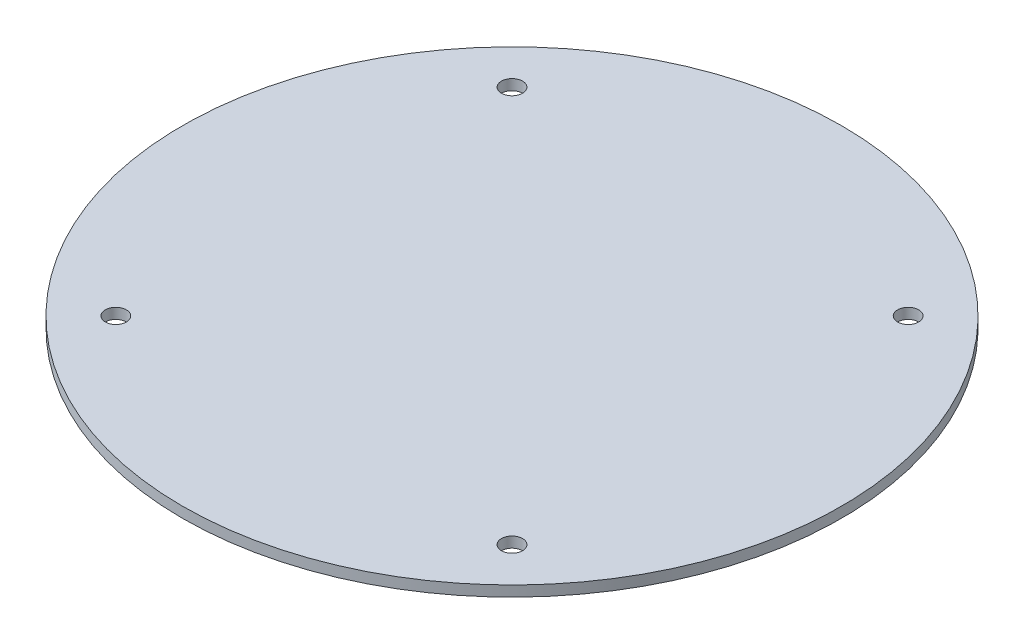
ISO-10303-21;
HEADER;
FILE_DESCRIPTION(('STEP AP214'),'2;1');
FILE_NAME('part.step','',(''),(''),'','','');
FILE_SCHEMA(('AUTOMOTIVE_DESIGN { 1 0 10303 214 1 1 1 1 }'));
ENDSEC;
DATA;
#1=APPLICATION_CONTEXT('core data for automotive mechanical design processes');
#2=APPLICATION_PROTOCOL_DEFINITION('international standard','automotive_design',2000,#1);
#3=PRODUCT_CONTEXT('',#1,'mechanical');
#4=PRODUCT('Part','Part','',(#3));
#5=PRODUCT_RELATED_PRODUCT_CATEGORY('part','',(#4));
#6=PRODUCT_DEFINITION_FORMATION('','',#4);
#7=PRODUCT_DEFINITION_CONTEXT('part definition',#1,'design');
#8=PRODUCT_DEFINITION('design','',#6,#7);
#9=PRODUCT_DEFINITION_SHAPE('','',#8);
#10=(LENGTH_UNIT() NAMED_UNIT(*) SI_UNIT(.MILLI.,.METRE.));
#11=(NAMED_UNIT(*) PLANE_ANGLE_UNIT() SI_UNIT($,.RADIAN.));
#12=(NAMED_UNIT(*) SI_UNIT($,.STERADIAN.) SOLID_ANGLE_UNIT());
#13=UNCERTAINTY_MEASURE_WITH_UNIT(LENGTH_MEASURE(1.E-05),#10,'distance_accuracy_value','');
#14=(GEOMETRIC_REPRESENTATION_CONTEXT(3) GLOBAL_UNCERTAINTY_ASSIGNED_CONTEXT((#13)) GLOBAL_UNIT_ASSIGNED_CONTEXT((#10,
#11,#12)) REPRESENTATION_CONTEXT('',''));
#15=CARTESIAN_POINT('',(0.,0.,0.));
#16=DIRECTION('',(0.,0.,1.));
#17=DIRECTION('',(1.,0.,0.));
#18=AXIS2_PLACEMENT_3D('',#15,#16,#17);
#19=CARTESIAN_POINT('',(0.,1.6,0.));
#20=DIRECTION('',(0.,-1.,0.));
#21=DIRECTION('',(0.,0.,-1.));
#22=AXIS2_PLACEMENT_3D('',#19,#20,#21);
#23=CYLINDRICAL_SURFACE('',#22,50.);
#24=CARTESIAN_POINT('',(0.,1.6,0.));
#25=DIRECTION('',(0.,1.,0.));
#26=DIRECTION('',(0.,0.,1.));
#27=AXIS2_PLACEMENT_3D('',#24,#25,#26);
#28=CIRCLE('',#27,50.);
#29=CARTESIAN_POINT('',(0.,1.6,50.));
#30=VERTEX_POINT('',#29);
#31=EDGE_CURVE('E11',#30,#30,#28,.T.);
#32=ORIENTED_EDGE('',*,*,#31,.F.);
#33=EDGE_LOOP('',(#32));
#34=FACE_BOUND('',#33,.T.);
#35=CARTESIAN_POINT('',(0.,0.,0.));
#36=DIRECTION('',(0.,1.,0.));
#37=DIRECTION('',(0.,0.,1.));
#38=AXIS2_PLACEMENT_3D('',#35,#36,#37);
#39=CIRCLE('',#38,50.);
#40=CARTESIAN_POINT('',(0.,0.,50.));
#41=VERTEX_POINT('',#40);
#42=EDGE_CURVE('E42',#41,#41,#39,.T.);
#43=ORIENTED_EDGE('',*,*,#42,.T.);
#44=EDGE_LOOP('',(#43));
#45=FACE_BOUND('',#44,.T.);
#46=ADVANCED_FACE('F41',(#34,#45),#23,.T.);
#47=CARTESIAN_POINT('',(0.,1.6,0.));
#48=DIRECTION('',(0.,1.,0.));
#49=DIRECTION('',(0.,0.,1.));
#50=AXIS2_PLACEMENT_3D('',#47,#48,#49);
#51=PLANE('',#50);
#52=CARTESIAN_POINT('',(30.0520382004278,1.6,-30.0520382004288));
#53=DIRECTION('',(0.,-1.,0.));
#54=DIRECTION('',(0.,0.,-1.));
#55=AXIS2_PLACEMENT_3D('',#52,#53,#54);
#56=CIRCLE('',#55,1.60000000000001);
#57=CARTESIAN_POINT('',(30.0520382004278,1.6,-31.6520382004288));
#58=VERTEX_POINT('',#57);
#59=EDGE_CURVE('E65',#58,#58,#56,.T.);
#60=ORIENTED_EDGE('',*,*,#59,.T.);
#61=EDGE_LOOP('',(#60));
#62=FACE_BOUND('',#61,.T.);
#63=CARTESIAN_POINT('',(30.0520382004286,1.6,30.0520382004279));
#64=DIRECTION('',(0.,-1.,0.));
#65=DIRECTION('',(0.,0.,-1.));
#66=AXIS2_PLACEMENT_3D('',#63,#64,#65);
#67=CIRCLE('',#66,1.60000000000001);
#68=CARTESIAN_POINT('',(30.0520382004286,1.6,28.4520382004279));
#69=VERTEX_POINT('',#68);
#70=EDGE_CURVE('E76',#69,#69,#67,.T.);
#71=ORIENTED_EDGE('',*,*,#70,.T.);
#72=EDGE_LOOP('',(#71));
#73=FACE_BOUND('',#72,.T.);
#74=CARTESIAN_POINT('',(-30.0520382004284,1.6,30.0520382004284));
#75=DIRECTION('',(0.,-1.,0.));
#76=DIRECTION('',(0.,0.,-1.));
#77=AXIS2_PLACEMENT_3D('',#74,#75,#76);
#78=CIRCLE('',#77,1.60000000000002);
#79=CARTESIAN_POINT('',(-30.0520382004284,1.6,28.4520382004284));
#80=VERTEX_POINT('',#79);
#81=EDGE_CURVE('E68',#80,#80,#78,.T.);
#82=ORIENTED_EDGE('',*,*,#81,.T.);
#83=EDGE_LOOP('',(#82));
#84=FACE_BOUND('',#83,.T.);
#85=CARTESIAN_POINT('',(-30.0520382004284,1.6,-30.0520382004281));
#86=DIRECTION('',(0.,-1.,0.));
#87=DIRECTION('',(0.,0.,-1.));
#88=AXIS2_PLACEMENT_3D('',#85,#86,#87);
#89=CIRCLE('',#88,1.60000000000001);
#90=CARTESIAN_POINT('',(-30.0520382004284,1.6,-31.6520382004281));
#91=VERTEX_POINT('',#90);
#92=EDGE_CURVE('E55',#91,#91,#89,.T.);
#93=ORIENTED_EDGE('',*,*,#92,.T.);
#94=EDGE_LOOP('',(#93));
#95=FACE_BOUND('',#94,.T.);
#96=ORIENTED_EDGE('',*,*,#31,.T.);
#97=EDGE_LOOP('',(#96));
#98=FACE_BOUND('',#97,.T.);
#99=ADVANCED_FACE('F89',(#62,#73,#84,#95,#98),#51,.T.);
#100=CARTESIAN_POINT('',(0.,0.,0.));
#101=DIRECTION('',(0.,1.,0.));
#102=DIRECTION('',(0.,0.,1.));
#103=AXIS2_PLACEMENT_3D('',#100,#101,#102);
#104=PLANE('',#103);
#105=CARTESIAN_POINT('',(30.0520382004278,0.,-30.0520382004288));
#106=DIRECTION('',(0.,-1.,0.));
#107=DIRECTION('',(0.,0.,-1.));
#108=AXIS2_PLACEMENT_3D('',#105,#106,#107);
#109=CIRCLE('',#108,1.60000000000001);
#110=CARTESIAN_POINT('',(30.0520382004278,0.,-31.6520382004288));
#111=VERTEX_POINT('',#110);
#112=EDGE_CURVE('E85',#111,#111,#109,.T.);
#113=ORIENTED_EDGE('',*,*,#112,.F.);
#114=EDGE_LOOP('',(#113));
#115=FACE_BOUND('',#114,.T.);
#116=CARTESIAN_POINT('',(30.0520382004286,0.,30.0520382004279));
#117=DIRECTION('',(0.,-1.,0.));
#118=DIRECTION('',(0.,0.,-1.));
#119=AXIS2_PLACEMENT_3D('',#116,#117,#118);
#120=CIRCLE('',#119,1.60000000000001);
#121=CARTESIAN_POINT('',(30.0520382004286,0.,28.4520382004279));
#122=VERTEX_POINT('',#121);
#123=EDGE_CURVE('E78',#122,#122,#120,.T.);
#124=ORIENTED_EDGE('',*,*,#123,.F.);
#125=EDGE_LOOP('',(#124));
#126=FACE_BOUND('',#125,.T.);
#127=CARTESIAN_POINT('',(-30.0520382004284,0.,30.0520382004284));
#128=DIRECTION('',(0.,-1.,0.));
#129=DIRECTION('',(0.,0.,-1.));
#130=AXIS2_PLACEMENT_3D('',#127,#128,#129);
#131=CIRCLE('',#130,1.60000000000002);
#132=CARTESIAN_POINT('',(-30.0520382004284,0.,28.4520382004284));
#133=VERTEX_POINT('',#132);
#134=EDGE_CURVE('E59',#133,#133,#131,.T.);
#135=ORIENTED_EDGE('',*,*,#134,.F.);
#136=EDGE_LOOP('',(#135));
#137=FACE_BOUND('',#136,.T.);
#138=CARTESIAN_POINT('',(-30.0520382004284,0.,-30.0520382004281));
#139=DIRECTION('',(0.,-1.,0.));
#140=DIRECTION('',(0.,0.,-1.));
#141=AXIS2_PLACEMENT_3D('',#138,#139,#140);
#142=CIRCLE('',#141,1.60000000000001);
#143=CARTESIAN_POINT('',(-30.0520382004284,0.,-31.6520382004281));
#144=VERTEX_POINT('',#143);
#145=EDGE_CURVE('E54',#144,#144,#142,.T.);
#146=ORIENTED_EDGE('',*,*,#145,.F.);
#147=EDGE_LOOP('',(#146));
#148=FACE_BOUND('',#147,.T.);
#149=ORIENTED_EDGE('',*,*,#42,.F.);
#150=EDGE_LOOP('',(#149));
#151=FACE_BOUND('',#150,.T.);
#152=ADVANCED_FACE('F109',(#115,#126,#137,#148,#151),#104,.F.);
#153=CARTESIAN_POINT('',(-30.0520382004284,1.6,-30.0520382004281));
#154=DIRECTION('',(0.,-1.,0.));
#155=DIRECTION('',(0.,0.,-1.));
#156=AXIS2_PLACEMENT_3D('',#153,#154,#155);
#157=CYLINDRICAL_SURFACE('',#156,1.60000000000001);
#158=ORIENTED_EDGE('',*,*,#92,.F.);
#159=EDGE_LOOP('',(#158));
#160=FACE_BOUND('',#159,.T.);
#161=ORIENTED_EDGE('',*,*,#145,.T.);
#162=EDGE_LOOP('',(#161));
#163=FACE_BOUND('',#162,.T.);
#164=ADVANCED_FACE('F113',(#160,#163),#157,.F.);
#165=CARTESIAN_POINT('',(-30.0520382004284,1.6,30.0520382004284));
#166=DIRECTION('',(0.,-1.,0.));
#167=DIRECTION('',(0.,0.,-1.));
#168=AXIS2_PLACEMENT_3D('',#165,#166,#167);
#169=CYLINDRICAL_SURFACE('',#168,1.60000000000002);
#170=ORIENTED_EDGE('',*,*,#81,.F.);
#171=EDGE_LOOP('',(#170));
#172=FACE_BOUND('',#171,.T.);
#173=ORIENTED_EDGE('',*,*,#134,.T.);
#174=EDGE_LOOP('',(#173));
#175=FACE_BOUND('',#174,.T.);
#176=ADVANCED_FACE('F99',(#172,#175),#169,.F.);
#177=CARTESIAN_POINT('',(30.0520382004286,1.6,30.0520382004279));
#178=DIRECTION('',(0.,-1.,0.));
#179=DIRECTION('',(0.,0.,-1.));
#180=AXIS2_PLACEMENT_3D('',#177,#178,#179);
#181=CYLINDRICAL_SURFACE('',#180,1.60000000000001);
#182=ORIENTED_EDGE('',*,*,#70,.F.);
#183=EDGE_LOOP('',(#182));
#184=FACE_BOUND('',#183,.T.);
#185=ORIENTED_EDGE('',*,*,#123,.T.);
#186=EDGE_LOOP('',(#185));
#187=FACE_BOUND('',#186,.T.);
#188=ADVANCED_FACE('F94',(#184,#187),#181,.F.);
#189=CARTESIAN_POINT('',(30.0520382004278,1.6,-30.0520382004288));
#190=DIRECTION('',(0.,-1.,0.));
#191=DIRECTION('',(0.,0.,-1.));
#192=AXIS2_PLACEMENT_3D('',#189,#190,#191);
#193=CYLINDRICAL_SURFACE('',#192,1.60000000000001);
#194=ORIENTED_EDGE('',*,*,#59,.F.);
#195=EDGE_LOOP('',(#194));
#196=FACE_BOUND('',#195,.T.);
#197=ORIENTED_EDGE('',*,*,#112,.T.);
#198=EDGE_LOOP('',(#197));
#199=FACE_BOUND('',#198,.T.);
#200=ADVANCED_FACE('F93',(#196,#199),#193,.F.);
#201=CLOSED_SHELL('',(#46,#99,#152,#164,#176,#188,#200));
#202=MANIFOLD_SOLID_BREP('B2',#201);
#203=ADVANCED_BREP_SHAPE_REPRESENTATION('',(#18,#202),#14);
#204=SHAPE_DEFINITION_REPRESENTATION(#9,#203);
ENDSEC;
END-ISO-10303-21;
